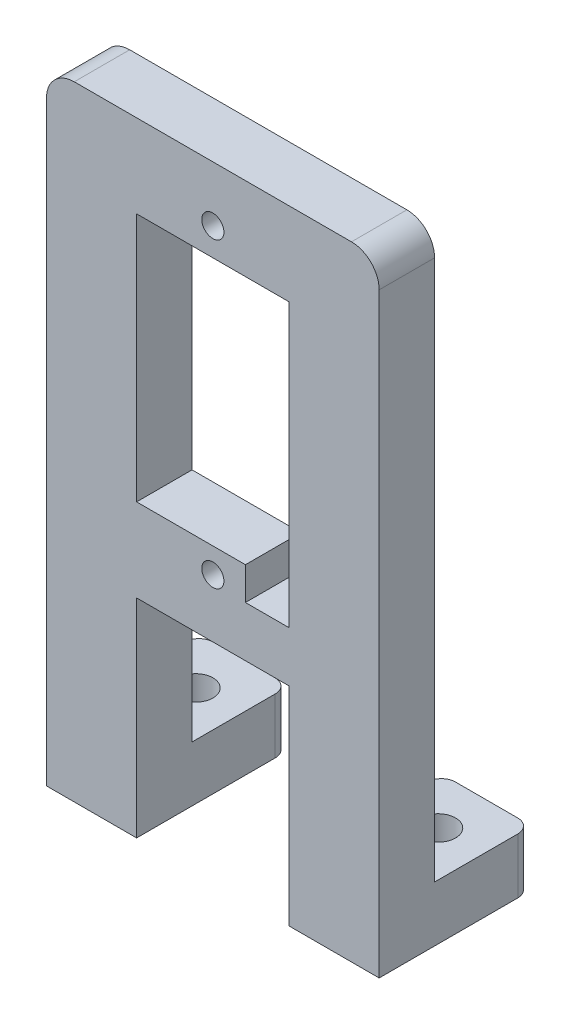
ISO-10303-21;
HEADER;
FILE_DESCRIPTION(('STEP AP214'),'2;1');
FILE_NAME('part.step','',(''),(''),'','','');
FILE_SCHEMA(('AUTOMOTIVE_DESIGN { 1 0 10303 214 1 1 1 1 }'));
ENDSEC;
DATA;
#1=APPLICATION_CONTEXT('core data for automotive mechanical design processes');
#2=APPLICATION_PROTOCOL_DEFINITION('international standard','automotive_design',2000,#1);
#3=PRODUCT_CONTEXT('',#1,'mechanical');
#4=PRODUCT('Part','Part','',(#3));
#5=PRODUCT_RELATED_PRODUCT_CATEGORY('part','',(#4));
#6=PRODUCT_DEFINITION_FORMATION('','',#4);
#7=PRODUCT_DEFINITION_CONTEXT('part definition',#1,'design');
#8=PRODUCT_DEFINITION('design','',#6,#7);
#9=PRODUCT_DEFINITION_SHAPE('','',#8);
#10=(LENGTH_UNIT() NAMED_UNIT(*) SI_UNIT(.MILLI.,.METRE.));
#11=(NAMED_UNIT(*) PLANE_ANGLE_UNIT() SI_UNIT($,.RADIAN.));
#12=(NAMED_UNIT(*) SI_UNIT($,.STERADIAN.) SOLID_ANGLE_UNIT());
#13=UNCERTAINTY_MEASURE_WITH_UNIT(LENGTH_MEASURE(1.E-05),#10,'distance_accuracy_value','');
#14=(GEOMETRIC_REPRESENTATION_CONTEXT(3) GLOBAL_UNCERTAINTY_ASSIGNED_CONTEXT((#13)) GLOBAL_UNIT_ASSIGNED_CONTEXT((#10,
#11,#12)) REPRESENTATION_CONTEXT('',''));
#15=CARTESIAN_POINT('',(0.,0.,0.));
#16=DIRECTION('',(0.,0.,1.));
#17=DIRECTION('',(1.,0.,0.));
#18=AXIS2_PLACEMENT_3D('',#15,#16,#17);
#19=CARTESIAN_POINT('',(0.,0.,0.));
#20=DIRECTION('',(0.,0.,-1.));
#21=DIRECTION('',(-1.,0.,0.));
#22=AXIS2_PLACEMENT_3D('',#19,#20,#21);
#23=PLANE('',#22);
#24=DIRECTION('',(-1.,0.,0.));
#25=VECTOR('',#24,1.);
#26=CARTESIAN_POINT('',(0.,-14.43,0.));
#27=LINE('',#26,#25);
#28=CARTESIAN_POINT('',(6.985,-14.43,0.));
#29=VERTEX_POINT('',#28);
#30=CARTESIAN_POINT('',(2.985,-14.43,0.));
#31=VERTEX_POINT('',#30);
#32=EDGE_CURVE('E233',#29,#31,#27,.T.);
#33=ORIENTED_EDGE('',*,*,#32,.F.);
#34=DIRECTION('',(0.,-1.,0.));
#35=VECTOR('',#34,1.);
#36=CARTESIAN_POINT('',(6.985,11.43,0.));
#37=LINE('',#36,#35);
#38=CARTESIAN_POINT('',(6.985,11.43,0.));
#39=VERTEX_POINT('',#38);
#40=EDGE_CURVE('E319',#39,#29,#37,.T.);
#41=ORIENTED_EDGE('',*,*,#40,.F.);
#42=DIRECTION('',(1.,0.,0.));
#43=VECTOR('',#42,1.);
#44=CARTESIAN_POINT('',(-6.985,11.43,0.));
#45=LINE('',#44,#43);
#46=CARTESIAN_POINT('',(-6.985,11.43,0.));
#47=VERTEX_POINT('',#46);
#48=EDGE_CURVE('E322',#47,#39,#45,.T.);
#49=ORIENTED_EDGE('',*,*,#48,.F.);
#50=DIRECTION('',(0.,-1.,0.));
#51=VECTOR('',#50,1.);
#52=CARTESIAN_POINT('',(-6.985,11.43,0.));
#53=LINE('',#52,#51);
#54=CARTESIAN_POINT('',(-6.985,-11.43,0.));
#55=VERTEX_POINT('',#54);
#56=EDGE_CURVE('E309',#47,#55,#53,.T.);
#57=ORIENTED_EDGE('',*,*,#56,.T.);
#58=DIRECTION('',(1.,0.,0.));
#59=VECTOR('',#58,1.);
#60=CARTESIAN_POINT('',(-6.985,-11.43,0.));
#61=LINE('',#60,#59);
#62=CARTESIAN_POINT('',(2.985,-11.43,0.));
#63=VERTEX_POINT('',#62);
#64=EDGE_CURVE('E316',#55,#63,#61,.T.);
#65=ORIENTED_EDGE('',*,*,#64,.T.);
#66=DIRECTION('',(0.,1.,0.));
#67=VECTOR('',#66,1.);
#68=CARTESIAN_POINT('',(2.985,0.,0.));
#69=LINE('',#68,#67);
#70=EDGE_CURVE('E251',#31,#63,#69,.T.);
#71=ORIENTED_EDGE('',*,*,#70,.F.);
#72=EDGE_LOOP('',(#33,#41,#49,#57,#65,#71));
#73=FACE_BOUND('',#72,.T.);
#74=CARTESIAN_POINT('',(0.,13.97,0.));
#75=DIRECTION('',(0.,0.,1.));
#76=DIRECTION('',(1.,0.,0.));
#77=AXIS2_PLACEMENT_3D('',#74,#75,#76);
#78=CIRCLE('',#77,1.016);
#79=CARTESIAN_POINT('',(1.016,13.97,0.));
#80=VERTEX_POINT('',#79);
#81=EDGE_CURVE('E281',#80,#80,#78,.T.);
#82=ORIENTED_EDGE('',*,*,#81,.T.);
#83=EDGE_LOOP('',(#82));
#84=FACE_BOUND('',#83,.T.);
#85=CARTESIAN_POINT('',(0.,-13.716,0.));
#86=DIRECTION('',(0.,0.,1.));
#87=DIRECTION('',(1.,0.,0.));
#88=AXIS2_PLACEMENT_3D('',#85,#86,#87);
#89=CIRCLE('',#88,1.016);
#90=CARTESIAN_POINT('',(1.016,-13.716,0.));
#91=VERTEX_POINT('',#90);
#92=EDGE_CURVE('E278',#91,#91,#89,.T.);
#93=ORIENTED_EDGE('',*,*,#92,.T.);
#94=EDGE_LOOP('',(#93));
#95=FACE_BOUND('',#94,.T.);
#96=DIRECTION('',(0.,-1.,0.));
#97=VECTOR('',#96,1.);
#98=CARTESIAN_POINT('',(15.24,19.05,0.));
#99=LINE('',#98,#97);
#100=CARTESIAN_POINT('',(15.24,16.51,0.));
#101=VERTEX_POINT('',#100);
#102=CARTESIAN_POINT('',(15.24,-33.02,0.));
#103=VERTEX_POINT('',#102);
#104=EDGE_CURVE('E348',#101,#103,#99,.T.);
#105=ORIENTED_EDGE('',*,*,#104,.T.);
#106=DIRECTION('',(-1.,0.,0.));
#107=VECTOR('',#106,1.);
#108=CARTESIAN_POINT('',(6.985,-33.02,0.));
#109=LINE('',#108,#107);
#110=CARTESIAN_POINT('',(6.985,-33.02,0.));
#111=VERTEX_POINT('',#110);
#112=EDGE_CURVE('E262',#103,#111,#109,.T.);
#113=ORIENTED_EDGE('',*,*,#112,.T.);
#114=DIRECTION('',(0.,1.,0.));
#115=VECTOR('',#114,1.);
#116=CARTESIAN_POINT('',(6.98499999999999,-38.1,0.));
#117=LINE('',#116,#115);
#118=CARTESIAN_POINT('',(6.98499999999999,-19.05,0.));
#119=VERTEX_POINT('',#118);
#120=EDGE_CURVE('E304',#111,#119,#117,.T.);
#121=ORIENTED_EDGE('',*,*,#120,.T.);
#122=DIRECTION('',(1.,0.,0.));
#123=VECTOR('',#122,1.);
#124=CARTESIAN_POINT('',(-15.24,-19.05,0.));
#125=LINE('',#124,#123);
#126=CARTESIAN_POINT('',(-6.985,-19.05,0.));
#127=VERTEX_POINT('',#126);
#128=EDGE_CURVE('E333',#127,#119,#125,.T.);
#129=ORIENTED_EDGE('',*,*,#128,.F.);
#130=DIRECTION('',(0.,1.,0.));
#131=VECTOR('',#130,1.);
#132=CARTESIAN_POINT('',(-6.98499999999999,-38.1,0.));
#133=LINE('',#132,#131);
#134=CARTESIAN_POINT('',(-6.985,-33.02,0.));
#135=VERTEX_POINT('',#134);
#136=EDGE_CURVE('E359',#135,#127,#133,.T.);
#137=ORIENTED_EDGE('',*,*,#136,.F.);
#138=DIRECTION('',(1.,0.,0.));
#139=VECTOR('',#138,1.);
#140=CARTESIAN_POINT('',(-6.985,-33.02,0.));
#141=LINE('',#140,#139);
#142=CARTESIAN_POINT('',(-15.24,-33.02,0.));
#143=VERTEX_POINT('',#142);
#144=EDGE_CURVE('E293',#143,#135,#141,.T.);
#145=ORIENTED_EDGE('',*,*,#144,.F.);
#146=DIRECTION('',(0.,-1.,0.));
#147=VECTOR('',#146,1.);
#148=CARTESIAN_POINT('',(-15.24,19.05,0.));
#149=LINE('',#148,#147);
#150=CARTESIAN_POINT('',(-15.24,16.51,0.));
#151=VERTEX_POINT('',#150);
#152=EDGE_CURVE('E338',#151,#143,#149,.T.);
#153=ORIENTED_EDGE('',*,*,#152,.F.);
#154=CARTESIAN_POINT('',(-12.7,16.51,0.));
#155=DIRECTION('',(0.,0.,-1.));
#156=DIRECTION('',(-1.,0.,0.));
#157=AXIS2_PLACEMENT_3D('',#154,#155,#156);
#158=CIRCLE('',#157,2.54);
#159=CARTESIAN_POINT('',(-12.7,19.05,0.));
#160=VERTEX_POINT('',#159);
#161=EDGE_CURVE('E391',#151,#160,#158,.T.);
#162=ORIENTED_EDGE('',*,*,#161,.T.);
#163=DIRECTION('',(1.,0.,0.));
#164=VECTOR('',#163,1.);
#165=CARTESIAN_POINT('',(-15.24,19.05,0.));
#166=LINE('',#165,#164);
#167=CARTESIAN_POINT('',(12.7,19.05,0.));
#168=VERTEX_POINT('',#167);
#169=EDGE_CURVE('E351',#160,#168,#166,.T.);
#170=ORIENTED_EDGE('',*,*,#169,.T.);
#171=CARTESIAN_POINT('',(12.7,16.51,0.));
#172=DIRECTION('',(0.,0.,-1.));
#173=DIRECTION('',(-1.,0.,0.));
#174=AXIS2_PLACEMENT_3D('',#171,#172,#173);
#175=CIRCLE('',#174,2.54);
#176=EDGE_CURVE('E393',#168,#101,#175,.T.);
#177=ORIENTED_EDGE('',*,*,#176,.T.);
#178=EDGE_LOOP('',(#105,#113,#121,#129,#137,#145,#153,#162,#170,#177));
#179=FACE_BOUND('',#178,.T.);
#180=ADVANCED_FACE('F63',(#73,#84,#95,#179),#23,.T.);
#181=CARTESIAN_POINT('',(6.985,11.43,5.08));
#182=DIRECTION('',(1.,0.,0.));
#183=DIRECTION('',(0.,0.,-1.));
#184=AXIS2_PLACEMENT_3D('',#181,#182,#183);
#185=PLANE('',#184);
#186=ORIENTED_EDGE('',*,*,#40,.T.);
#187=DIRECTION('',(0.,0.,1.));
#188=VECTOR('',#187,1.);
#189=CARTESIAN_POINT('',(6.985,-14.43,-8.89));
#190=LINE('',#189,#188);
#191=CARTESIAN_POINT('',(6.985,-14.43,5.08));
#192=VERTEX_POINT('',#191);
#193=EDGE_CURVE('E235',#29,#192,#190,.T.);
#194=ORIENTED_EDGE('',*,*,#193,.T.);
#195=DIRECTION('',(0.,-1.,0.));
#196=VECTOR('',#195,1.);
#197=CARTESIAN_POINT('',(6.985,11.43,5.08));
#198=LINE('',#197,#196);
#199=CARTESIAN_POINT('',(6.985,11.43,5.08));
#200=VERTEX_POINT('',#199);
#201=EDGE_CURVE('E246',#200,#192,#198,.T.);
#202=ORIENTED_EDGE('',*,*,#201,.F.);
#203=DIRECTION('',(0.,0.,-1.));
#204=VECTOR('',#203,1.);
#205=CARTESIAN_POINT('',(6.985,11.43,5.08));
#206=LINE('',#205,#204);
#207=EDGE_CURVE('E331',#200,#39,#206,.T.);
#208=ORIENTED_EDGE('',*,*,#207,.T.);
#209=EDGE_LOOP('',(#186,#194,#202,#208));
#210=FACE_BOUND('',#209,.T.);
#211=ADVANCED_FACE('F474',(#210),#185,.F.);
#212=CARTESIAN_POINT('',(-6.985,11.43,5.08));
#213=DIRECTION('',(0.,1.,0.));
#214=DIRECTION('',(0.,0.,1.));
#215=AXIS2_PLACEMENT_3D('',#212,#213,#214);
#216=PLANE('',#215);
#217=ORIENTED_EDGE('',*,*,#48,.T.);
#218=ORIENTED_EDGE('',*,*,#207,.F.);
#219=DIRECTION('',(1.,0.,0.));
#220=VECTOR('',#219,1.);
#221=CARTESIAN_POINT('',(-6.985,11.43,5.08));
#222=LINE('',#221,#220);
#223=CARTESIAN_POINT('',(-6.985,11.43,5.08));
#224=VERTEX_POINT('',#223);
#225=EDGE_CURVE('E311',#224,#200,#222,.T.);
#226=ORIENTED_EDGE('',*,*,#225,.F.);
#227=DIRECTION('',(0.,0.,-1.));
#228=VECTOR('',#227,1.);
#229=CARTESIAN_POINT('',(-6.985,11.43,5.08));
#230=LINE('',#229,#228);
#231=EDGE_CURVE('E329',#224,#47,#230,.T.);
#232=ORIENTED_EDGE('',*,*,#231,.T.);
#233=EDGE_LOOP('',(#217,#218,#226,#232));
#234=FACE_BOUND('',#233,.T.);
#235=ADVANCED_FACE('F481',(#234),#216,.F.);
#236=CARTESIAN_POINT('',(-6.985,11.43,5.08));
#237=DIRECTION('',(1.,0.,0.));
#238=DIRECTION('',(0.,0.,-1.));
#239=AXIS2_PLACEMENT_3D('',#236,#237,#238);
#240=PLANE('',#239);
#241=ORIENTED_EDGE('',*,*,#56,.F.);
#242=ORIENTED_EDGE('',*,*,#231,.F.);
#243=DIRECTION('',(0.,-1.,0.));
#244=VECTOR('',#243,1.);
#245=CARTESIAN_POINT('',(-6.985,11.43,5.08));
#246=LINE('',#245,#244);
#247=CARTESIAN_POINT('',(-6.985,-11.43,5.08));
#248=VERTEX_POINT('',#247);
#249=EDGE_CURVE('E313',#224,#248,#246,.T.);
#250=ORIENTED_EDGE('',*,*,#249,.T.);
#251=DIRECTION('',(0.,0.,-1.));
#252=VECTOR('',#251,1.);
#253=CARTESIAN_POINT('',(-6.985,-11.43,5.08));
#254=LINE('',#253,#252);
#255=EDGE_CURVE('E315',#248,#55,#254,.T.);
#256=ORIENTED_EDGE('',*,*,#255,.T.);
#257=EDGE_LOOP('',(#241,#242,#250,#256));
#258=FACE_BOUND('',#257,.T.);
#259=ADVANCED_FACE('F568',(#258),#240,.T.);
#260=CARTESIAN_POINT('',(-6.985,-11.43,5.08));
#261=DIRECTION('',(0.,1.,0.));
#262=DIRECTION('',(0.,0.,1.));
#263=AXIS2_PLACEMENT_3D('',#260,#261,#262);
#264=PLANE('',#263);
#265=DIRECTION('',(0.,0.,1.));
#266=VECTOR('',#265,1.);
#267=CARTESIAN_POINT('',(2.985,-11.43,-8.89));
#268=LINE('',#267,#266);
#269=CARTESIAN_POINT('',(2.985,-11.43,5.08));
#270=VERTEX_POINT('',#269);
#271=EDGE_CURVE('E78',#63,#270,#268,.T.);
#272=ORIENTED_EDGE('',*,*,#271,.F.);
#273=ORIENTED_EDGE('',*,*,#64,.F.);
#274=ORIENTED_EDGE('',*,*,#255,.F.);
#275=DIRECTION('',(1.,0.,0.));
#276=VECTOR('',#275,1.);
#277=CARTESIAN_POINT('',(-6.985,-11.43,5.08));
#278=LINE('',#277,#276);
#279=EDGE_CURVE('E307',#248,#270,#278,.T.);
#280=ORIENTED_EDGE('',*,*,#279,.T.);
#281=EDGE_LOOP('',(#272,#273,#274,#280));
#282=FACE_BOUND('',#281,.T.);
#283=ADVANCED_FACE('F571',(#282),#264,.T.);
#284=CARTESIAN_POINT('',(-15.24,19.05,5.08));
#285=DIRECTION('',(1.,0.,0.));
#286=DIRECTION('',(0.,0.,-1.));
#287=AXIS2_PLACEMENT_3D('',#284,#285,#286);
#288=PLANE('',#287);
#289=DIRECTION('',(0.,0.,1.));
#290=VECTOR('',#289,1.);
#291=CARTESIAN_POINT('',(-15.24,-33.02,0.));
#292=LINE('',#291,#290);
#293=CARTESIAN_POINT('',(-15.24,-33.02,-7.62));
#294=VERTEX_POINT('',#293);
#295=EDGE_CURVE('E302',#294,#143,#292,.T.);
#296=ORIENTED_EDGE('',*,*,#295,.F.);
#297=DIRECTION('',(0.,-1.,0.));
#298=VECTOR('',#297,1.);
#299=CARTESIAN_POINT('',(-15.24,19.05,-7.62));
#300=LINE('',#299,#298);
#301=CARTESIAN_POINT('',(-15.24,-38.1,-7.62));
#302=VERTEX_POINT('',#301);
#303=EDGE_CURVE('E12',#294,#302,#300,.T.);
#304=ORIENTED_EDGE('',*,*,#303,.T.);
#305=DIRECTION('',(0.,0.,-1.));
#306=VECTOR('',#305,1.);
#307=CARTESIAN_POINT('',(-15.24,-38.1,5.08));
#308=LINE('',#307,#306);
#309=CARTESIAN_POINT('',(-15.24,-38.1,5.08));
#310=VERTEX_POINT('',#309);
#311=EDGE_CURVE('E320',#310,#302,#308,.T.);
#312=ORIENTED_EDGE('',*,*,#311,.F.);
#313=DIRECTION('',(0.,-1.,0.));
#314=VECTOR('',#313,1.);
#315=CARTESIAN_POINT('',(-15.24,19.05,5.08));
#316=LINE('',#315,#314);
#317=CARTESIAN_POINT('',(-15.24,16.51,5.08));
#318=VERTEX_POINT('',#317);
#319=EDGE_CURVE('E343',#318,#310,#316,.T.);
#320=ORIENTED_EDGE('',*,*,#319,.F.);
#321=DIRECTION('',(0.,0.,-1.));
#322=VECTOR('',#321,1.);
#323=CARTESIAN_POINT('',(-15.24,16.51,0.));
#324=LINE('',#323,#322);
#325=EDGE_CURVE('E401',#318,#151,#324,.T.);
#326=ORIENTED_EDGE('',*,*,#325,.T.);
#327=ORIENTED_EDGE('',*,*,#152,.T.);
#328=EDGE_LOOP('',(#296,#304,#312,#320,#326,#327));
#329=FACE_BOUND('',#328,.T.);
#330=ADVANCED_FACE('F539',(#329),#288,.F.);
#331=CARTESIAN_POINT('',(-15.24,19.05,5.08));
#332=DIRECTION('',(0.,1.,0.));
#333=DIRECTION('',(0.,0.,1.));
#334=AXIS2_PLACEMENT_3D('',#331,#332,#333);
#335=PLANE('',#334);
#336=DIRECTION('',(1.,0.,0.));
#337=VECTOR('',#336,1.);
#338=CARTESIAN_POINT('',(-15.24,19.05,5.08));
#339=LINE('',#338,#337);
#340=CARTESIAN_POINT('',(-12.7,19.05,5.08));
#341=VERTEX_POINT('',#340);
#342=CARTESIAN_POINT('',(12.7,19.05,5.08));
#343=VERTEX_POINT('',#342);
#344=EDGE_CURVE('E340',#341,#343,#339,.T.);
#345=ORIENTED_EDGE('',*,*,#344,.T.);
#346=DIRECTION('',(0.,0.,-1.));
#347=VECTOR('',#346,1.);
#348=CARTESIAN_POINT('',(12.7,19.05,5.08));
#349=LINE('',#348,#347);
#350=EDGE_CURVE('E388',#343,#168,#349,.T.);
#351=ORIENTED_EDGE('',*,*,#350,.T.);
#352=ORIENTED_EDGE('',*,*,#169,.F.);
#353=DIRECTION('',(0.,0.,-1.));
#354=VECTOR('',#353,1.);
#355=CARTESIAN_POINT('',(-12.7,19.05,5.08));
#356=LINE('',#355,#354);
#357=EDGE_CURVE('E368',#160,#341,#356,.F.);
#358=ORIENTED_EDGE('',*,*,#357,.T.);
#359=EDGE_LOOP('',(#345,#351,#352,#358));
#360=FACE_BOUND('',#359,.T.);
#361=ADVANCED_FACE('F531',(#360),#335,.T.);
#362=CARTESIAN_POINT('',(15.24,19.05,5.08));
#363=DIRECTION('',(1.,0.,0.));
#364=DIRECTION('',(0.,0.,-1.));
#365=AXIS2_PLACEMENT_3D('',#362,#363,#364);
#366=PLANE('',#365);
#367=DIRECTION('',(0.,0.,-1.));
#368=VECTOR('',#367,1.);
#369=CARTESIAN_POINT('',(15.24,-38.1,5.08));
#370=LINE('',#369,#368);
#371=CARTESIAN_POINT('',(15.24,-38.1,5.08));
#372=VERTEX_POINT('',#371);
#373=CARTESIAN_POINT('',(15.24,-38.1,-7.62));
#374=VERTEX_POINT('',#373);
#375=EDGE_CURVE('E379',#372,#374,#370,.T.);
#376=ORIENTED_EDGE('',*,*,#375,.T.);
#377=DIRECTION('',(0.,-1.,0.));
#378=VECTOR('',#377,1.);
#379=CARTESIAN_POINT('',(15.24,19.05,-7.62));
#380=LINE('',#379,#378);
#381=CARTESIAN_POINT('',(15.24,-33.02,-7.62));
#382=VERTEX_POINT('',#381);
#383=EDGE_CURVE('E428',#374,#382,#380,.F.);
#384=ORIENTED_EDGE('',*,*,#383,.T.);
#385=DIRECTION('',(0.,0.,1.));
#386=VECTOR('',#385,1.);
#387=CARTESIAN_POINT('',(15.24,-33.02,0.));
#388=LINE('',#387,#386);
#389=EDGE_CURVE('E265',#382,#103,#388,.T.);
#390=ORIENTED_EDGE('',*,*,#389,.T.);
#391=ORIENTED_EDGE('',*,*,#104,.F.);
#392=DIRECTION('',(0.,0.,-1.));
#393=VECTOR('',#392,1.);
#394=CARTESIAN_POINT('',(15.24,16.51,5.08));
#395=LINE('',#394,#393);
#396=CARTESIAN_POINT('',(15.24,16.51,5.08));
#397=VERTEX_POINT('',#396);
#398=EDGE_CURVE('E395',#101,#397,#395,.F.);
#399=ORIENTED_EDGE('',*,*,#398,.T.);
#400=DIRECTION('',(0.,-1.,0.));
#401=VECTOR('',#400,1.);
#402=CARTESIAN_POINT('',(15.24,19.05,5.08));
#403=LINE('',#402,#401);
#404=EDGE_CURVE('E337',#397,#372,#403,.T.);
#405=ORIENTED_EDGE('',*,*,#404,.T.);
#406=EDGE_LOOP('',(#376,#384,#390,#391,#399,#405));
#407=FACE_BOUND('',#406,.T.);
#408=ADVANCED_FACE('F524',(#407),#366,.T.);
#409=CARTESIAN_POINT('',(0.,0.,5.08));
#410=DIRECTION('',(0.,0.,-1.));
#411=DIRECTION('',(-1.,0.,0.));
#412=AXIS2_PLACEMENT_3D('',#409,#410,#411);
#413=PLANE('',#412);
#414=CARTESIAN_POINT('',(0.,13.97,5.08));
#415=DIRECTION('',(0.,0.,1.));
#416=DIRECTION('',(1.,0.,0.));
#417=AXIS2_PLACEMENT_3D('',#414,#415,#416);
#418=CIRCLE('',#417,1.016);
#419=CARTESIAN_POINT('',(1.016,13.97,5.08));
#420=VERTEX_POINT('',#419);
#421=EDGE_CURVE('E285',#420,#420,#418,.T.);
#422=ORIENTED_EDGE('',*,*,#421,.F.);
#423=EDGE_LOOP('',(#422));
#424=FACE_BOUND('',#423,.T.);
#425=CARTESIAN_POINT('',(0.,-13.716,5.08));
#426=DIRECTION('',(0.,0.,1.));
#427=DIRECTION('',(1.,0.,0.));
#428=AXIS2_PLACEMENT_3D('',#425,#426,#427);
#429=CIRCLE('',#428,1.016);
#430=CARTESIAN_POINT('',(1.016,-13.716,5.08));
#431=VERTEX_POINT('',#430);
#432=EDGE_CURVE('E288',#431,#431,#429,.T.);
#433=ORIENTED_EDGE('',*,*,#432,.F.);
#434=EDGE_LOOP('',(#433));
#435=FACE_BOUND('',#434,.T.);
#436=ORIENTED_EDGE('',*,*,#404,.F.);
#437=CARTESIAN_POINT('',(12.7,16.51,5.08));
#438=DIRECTION('',(0.,0.,-1.));
#439=DIRECTION('',(-1.,0.,0.));
#440=AXIS2_PLACEMENT_3D('',#437,#438,#439);
#441=CIRCLE('',#440,2.54);
#442=EDGE_CURVE('E399',#397,#343,#441,.F.);
#443=ORIENTED_EDGE('',*,*,#442,.T.);
#444=ORIENTED_EDGE('',*,*,#344,.F.);
#445=CARTESIAN_POINT('',(-12.7,16.51,5.08));
#446=DIRECTION('',(0.,0.,-1.));
#447=DIRECTION('',(-1.,0.,0.));
#448=AXIS2_PLACEMENT_3D('',#445,#446,#447);
#449=CIRCLE('',#448,2.54);
#450=EDGE_CURVE('E397',#341,#318,#449,.F.);
#451=ORIENTED_EDGE('',*,*,#450,.T.);
#452=ORIENTED_EDGE('',*,*,#319,.T.);
#453=DIRECTION('',(1.,0.,0.));
#454=VECTOR('',#453,1.);
#455=CARTESIAN_POINT('',(-15.24,-38.1,5.08));
#456=LINE('',#455,#454);
#457=CARTESIAN_POINT('',(-6.98499999999999,-38.1,5.08));
#458=VERTEX_POINT('',#457);
#459=EDGE_CURVE('E356',#310,#458,#456,.T.);
#460=ORIENTED_EDGE('',*,*,#459,.T.);
#461=DIRECTION('',(0.,1.,0.));
#462=VECTOR('',#461,1.);
#463=CARTESIAN_POINT('',(-6.98499999999999,-38.1,5.08));
#464=LINE('',#463,#462);
#465=CARTESIAN_POINT('',(-6.985,-19.05,5.08));
#466=VERTEX_POINT('',#465);
#467=EDGE_CURVE('E358',#458,#466,#464,.T.);
#468=ORIENTED_EDGE('',*,*,#467,.T.);
#469=DIRECTION('',(1.,0.,0.));
#470=VECTOR('',#469,1.);
#471=CARTESIAN_POINT('',(-15.24,-19.05,5.08));
#472=LINE('',#471,#470);
#473=CARTESIAN_POINT('',(6.98499999999999,-19.05,5.08));
#474=VERTEX_POINT('',#473);
#475=EDGE_CURVE('E334',#466,#474,#472,.T.);
#476=ORIENTED_EDGE('',*,*,#475,.T.);
#477=DIRECTION('',(0.,1.,0.));
#478=VECTOR('',#477,1.);
#479=CARTESIAN_POINT('',(6.98499999999999,-38.1,5.08));
#480=LINE('',#479,#478);
#481=CARTESIAN_POINT('',(6.98499999999999,-38.1,5.08));
#482=VERTEX_POINT('',#481);
#483=EDGE_CURVE('E376',#482,#474,#480,.T.);
#484=ORIENTED_EDGE('',*,*,#483,.F.);
#485=DIRECTION('',(-1.,0.,0.));
#486=VECTOR('',#485,1.);
#487=CARTESIAN_POINT('',(15.24,-38.1,5.08));
#488=LINE('',#487,#486);
#489=EDGE_CURVE('E373',#372,#482,#488,.T.);
#490=ORIENTED_EDGE('',*,*,#489,.F.);
#491=EDGE_LOOP('',(#436,#443,#444,#451,#452,#460,#468,#476,#484,#490));
#492=FACE_BOUND('',#491,.T.);
#493=ORIENTED_EDGE('',*,*,#201,.T.);
#494=DIRECTION('',(1.,0.,0.));
#495=VECTOR('',#494,1.);
#496=CARTESIAN_POINT('',(6.985,-14.43,5.08));
#497=LINE('',#496,#495);
#498=CARTESIAN_POINT('',(2.985,-14.43,5.08));
#499=VERTEX_POINT('',#498);
#500=EDGE_CURVE('E231',#499,#192,#497,.T.);
#501=ORIENTED_EDGE('',*,*,#500,.F.);
#502=DIRECTION('',(0.,-1.,0.));
#503=VECTOR('',#502,1.);
#504=CARTESIAN_POINT('',(2.985,-14.43,5.08));
#505=LINE('',#504,#503);
#506=EDGE_CURVE('E237',#270,#499,#505,.T.);
#507=ORIENTED_EDGE('',*,*,#506,.F.);
#508=ORIENTED_EDGE('',*,*,#279,.F.);
#509=ORIENTED_EDGE('',*,*,#249,.F.);
#510=ORIENTED_EDGE('',*,*,#225,.T.);
#511=EDGE_LOOP('',(#493,#501,#507,#508,#509,#510));
#512=FACE_BOUND('',#511,.T.);
#513=ADVANCED_FACE('F243',(#424,#435,#492,#512),#413,.F.);
#514=CARTESIAN_POINT('',(-15.24,-19.05,5.08));
#515=DIRECTION('',(0.,1.,0.));
#516=DIRECTION('',(0.,0.,1.));
#517=AXIS2_PLACEMENT_3D('',#514,#515,#516);
#518=PLANE('',#517);
#519=ORIENTED_EDGE('',*,*,#475,.F.);
#520=DIRECTION('',(0.,0.,-1.));
#521=VECTOR('',#520,1.);
#522=CARTESIAN_POINT('',(-6.98499999999999,-19.05,5.08));
#523=LINE('',#522,#521);
#524=EDGE_CURVE('E365',#466,#127,#523,.T.);
#525=ORIENTED_EDGE('',*,*,#524,.T.);
#526=ORIENTED_EDGE('',*,*,#128,.T.);
#527=DIRECTION('',(0.,0.,-1.));
#528=VECTOR('',#527,1.);
#529=CARTESIAN_POINT('',(6.98499999999999,-19.05,5.08));
#530=LINE('',#529,#528);
#531=EDGE_CURVE('E345',#474,#119,#530,.T.);
#532=ORIENTED_EDGE('',*,*,#531,.F.);
#533=EDGE_LOOP('',(#519,#525,#526,#532));
#534=FACE_BOUND('',#533,.T.);
#535=ADVANCED_FACE('F448',(#534),#518,.F.);
#536=CARTESIAN_POINT('',(15.24,-38.1,5.08));
#537=DIRECTION('',(0.,-1.,0.));
#538=DIRECTION('',(0.,0.,-1.));
#539=AXIS2_PLACEMENT_3D('',#536,#537,#538);
#540=PLANE('',#539);
#541=CARTESIAN_POINT('',(11.1125,-38.1,-4.445));
#542=DIRECTION('',(0.,-1.,0.));
#543=DIRECTION('',(0.,0.,1.));
#544=AXIS2_PLACEMENT_3D('',#541,#542,#543);
#545=CIRCLE('',#544,1.6);
#546=CARTESIAN_POINT('',(11.1125,-38.1,-2.845));
#547=VERTEX_POINT('',#546);
#548=EDGE_CURVE('E256',#547,#547,#545,.T.);
#549=ORIENTED_EDGE('',*,*,#548,.F.);
#550=EDGE_LOOP('',(#549));
#551=FACE_BOUND('',#550,.T.);
#552=DIRECTION('',(1.,0.,0.));
#553=VECTOR('',#552,1.);
#554=CARTESIAN_POINT('',(15.24,-38.1,-8.89));
#555=LINE('',#554,#553);
#556=CARTESIAN_POINT('',(8.25499999999999,-38.1,-8.89));
#557=VERTEX_POINT('',#556);
#558=CARTESIAN_POINT('',(13.97,-38.1,-8.89));
#559=VERTEX_POINT('',#558);
#560=EDGE_CURVE('E259',#557,#559,#555,.T.);
#561=ORIENTED_EDGE('',*,*,#560,.T.);
#562=CARTESIAN_POINT('',(13.97,-38.1,-7.62));
#563=DIRECTION('',(0.,-1.,0.));
#564=DIRECTION('',(0.,0.,-1.));
#565=AXIS2_PLACEMENT_3D('',#562,#563,#564);
#566=CIRCLE('',#565,1.27);
#567=EDGE_CURVE('E426',#559,#374,#566,.T.);
#568=ORIENTED_EDGE('',*,*,#567,.T.);
#569=ORIENTED_EDGE('',*,*,#375,.F.);
#570=ORIENTED_EDGE('',*,*,#489,.T.);
#571=DIRECTION('',(0.,0.,-1.));
#572=VECTOR('',#571,1.);
#573=CARTESIAN_POINT('',(6.98499999999999,-38.1,5.08));
#574=LINE('',#573,#572);
#575=CARTESIAN_POINT('',(6.98499999999999,-38.1,-7.62));
#576=VERTEX_POINT('',#575);
#577=EDGE_CURVE('E364',#482,#576,#574,.T.);
#578=ORIENTED_EDGE('',*,*,#577,.T.);
#579=CARTESIAN_POINT('',(8.25499999999999,-38.1,-7.62));
#580=DIRECTION('',(0.,-1.,0.));
#581=DIRECTION('',(0.,0.,-1.));
#582=AXIS2_PLACEMENT_3D('',#579,#580,#581);
#583=CIRCLE('',#582,1.27);
#584=EDGE_CURVE('E424',#576,#557,#583,.T.);
#585=ORIENTED_EDGE('',*,*,#584,.T.);
#586=EDGE_LOOP('',(#561,#568,#569,#570,#578,#585));
#587=FACE_BOUND('',#586,.T.);
#588=ADVANCED_FACE('F438',(#551,#587),#540,.T.);
#589=CARTESIAN_POINT('',(6.98499999999999,-38.1,5.08));
#590=DIRECTION('',(-1.,0.,0.));
#591=DIRECTION('',(0.,0.,1.));
#592=AXIS2_PLACEMENT_3D('',#589,#590,#591);
#593=PLANE('',#592);
#594=DIRECTION('',(0.,0.,-1.));
#595=VECTOR('',#594,1.);
#596=CARTESIAN_POINT('',(6.985,-33.02,-8.89));
#597=LINE('',#596,#595);
#598=CARTESIAN_POINT('',(6.985,-33.02,-7.62));
#599=VERTEX_POINT('',#598);
#600=EDGE_CURVE('E270',#111,#599,#597,.T.);
#601=ORIENTED_EDGE('',*,*,#600,.T.);
#602=DIRECTION('',(0.,-1.,0.));
#603=VECTOR('',#602,1.);
#604=CARTESIAN_POINT('',(6.98499999999999,-38.1,-7.62));
#605=LINE('',#604,#603);
#606=EDGE_CURVE('E71',#599,#576,#605,.T.);
#607=ORIENTED_EDGE('',*,*,#606,.T.);
#608=ORIENTED_EDGE('',*,*,#577,.F.);
#609=ORIENTED_EDGE('',*,*,#483,.T.);
#610=ORIENTED_EDGE('',*,*,#531,.T.);
#611=ORIENTED_EDGE('',*,*,#120,.F.);
#612=EDGE_LOOP('',(#601,#607,#608,#609,#610,#611));
#613=FACE_BOUND('',#612,.T.);
#614=ADVANCED_FACE('F435',(#613),#593,.T.);
#615=CARTESIAN_POINT('',(-15.24,-38.1,5.08));
#616=DIRECTION('',(0.,1.,0.));
#617=DIRECTION('',(0.,0.,1.));
#618=AXIS2_PLACEMENT_3D('',#615,#616,#617);
#619=PLANE('',#618);
#620=CARTESIAN_POINT('',(-11.1125,-38.1,-4.445));
#621=DIRECTION('',(0.,1.,0.));
#622=DIRECTION('',(0.,0.,1.));
#623=AXIS2_PLACEMENT_3D('',#620,#621,#622);
#624=CIRCLE('',#623,1.6);
#625=CARTESIAN_POINT('',(-11.1125,-38.1,-2.845));
#626=VERTEX_POINT('',#625);
#627=EDGE_CURVE('E275',#626,#626,#624,.T.);
#628=ORIENTED_EDGE('',*,*,#627,.T.);
#629=EDGE_LOOP('',(#628));
#630=FACE_BOUND('',#629,.T.);
#631=DIRECTION('',(-1.,0.,0.));
#632=VECTOR('',#631,1.);
#633=CARTESIAN_POINT('',(-15.24,-38.1,-8.89));
#634=LINE('',#633,#632);
#635=CARTESIAN_POINT('',(-8.25499999999999,-38.1,-8.89));
#636=VERTEX_POINT('',#635);
#637=CARTESIAN_POINT('',(-13.97,-38.1,-8.89));
#638=VERTEX_POINT('',#637);
#639=EDGE_CURVE('E284',#636,#638,#634,.T.);
#640=ORIENTED_EDGE('',*,*,#639,.F.);
#641=CARTESIAN_POINT('',(-8.25499999999999,-38.1,-7.62));
#642=DIRECTION('',(0.,1.,0.));
#643=DIRECTION('',(0.,0.,1.));
#644=AXIS2_PLACEMENT_3D('',#641,#642,#643);
#645=CIRCLE('',#644,1.27);
#646=CARTESIAN_POINT('',(-6.98499999999999,-38.1,-7.62));
#647=VERTEX_POINT('',#646);
#648=EDGE_CURVE('E411',#636,#647,#645,.F.);
#649=ORIENTED_EDGE('',*,*,#648,.T.);
#650=DIRECTION('',(0.,0.,-1.));
#651=VECTOR('',#650,1.);
#652=CARTESIAN_POINT('',(-6.98499999999999,-38.1,5.08));
#653=LINE('',#652,#651);
#654=EDGE_CURVE('E362',#458,#647,#653,.T.);
#655=ORIENTED_EDGE('',*,*,#654,.F.);
#656=ORIENTED_EDGE('',*,*,#459,.F.);
#657=ORIENTED_EDGE('',*,*,#311,.T.);
#658=CARTESIAN_POINT('',(-13.97,-38.1,-7.62));
#659=DIRECTION('',(0.,1.,0.));
#660=DIRECTION('',(0.,0.,1.));
#661=AXIS2_PLACEMENT_3D('',#658,#659,#660);
#662=CIRCLE('',#661,1.27);
#663=EDGE_CURVE('E409',#302,#638,#662,.F.);
#664=ORIENTED_EDGE('',*,*,#663,.T.);
#665=EDGE_LOOP('',(#640,#649,#655,#656,#657,#664));
#666=FACE_BOUND('',#665,.T.);
#667=ADVANCED_FACE('F488',(#630,#666),#619,.F.);
#668=CARTESIAN_POINT('',(-6.98499999999999,-38.1,5.08));
#669=DIRECTION('',(-1.,0.,0.));
#670=DIRECTION('',(0.,0.,1.));
#671=AXIS2_PLACEMENT_3D('',#668,#669,#670);
#672=PLANE('',#671);
#673=ORIENTED_EDGE('',*,*,#654,.T.);
#674=DIRECTION('',(0.,-1.,0.));
#675=VECTOR('',#674,1.);
#676=CARTESIAN_POINT('',(-6.98499999999999,-38.1,-7.62));
#677=LINE('',#676,#675);
#678=CARTESIAN_POINT('',(-6.985,-33.02,-7.62));
#679=VERTEX_POINT('',#678);
#680=EDGE_CURVE('E413',#647,#679,#677,.F.);
#681=ORIENTED_EDGE('',*,*,#680,.T.);
#682=DIRECTION('',(0.,0.,-1.));
#683=VECTOR('',#682,1.);
#684=CARTESIAN_POINT('',(-6.985,-33.02,-8.89));
#685=LINE('',#684,#683);
#686=EDGE_CURVE('E296',#135,#679,#685,.T.);
#687=ORIENTED_EDGE('',*,*,#686,.F.);
#688=ORIENTED_EDGE('',*,*,#136,.T.);
#689=ORIENTED_EDGE('',*,*,#524,.F.);
#690=ORIENTED_EDGE('',*,*,#467,.F.);
#691=EDGE_LOOP('',(#673,#681,#687,#688,#689,#690));
#692=FACE_BOUND('',#691,.T.);
#693=ADVANCED_FACE('F494',(#692),#672,.F.);
#694=CARTESIAN_POINT('',(12.7,16.51,5.08));
#695=DIRECTION('',(0.,0.,-1.));
#696=DIRECTION('',(-1.,0.,0.));
#697=AXIS2_PLACEMENT_3D('',#694,#695,#696);
#698=CYLINDRICAL_SURFACE('',#697,2.54);
#699=ORIENTED_EDGE('',*,*,#442,.F.);
#700=ORIENTED_EDGE('',*,*,#398,.F.);
#701=ORIENTED_EDGE('',*,*,#176,.F.);
#702=ORIENTED_EDGE('',*,*,#350,.F.);
#703=EDGE_LOOP('',(#699,#700,#701,#702));
#704=FACE_BOUND('',#703,.T.);
#705=ADVANCED_FACE('F501',(#704),#698,.T.);
#706=CARTESIAN_POINT('',(-12.7,16.51,5.08));
#707=DIRECTION('',(0.,0.,1.));
#708=DIRECTION('',(1.,0.,0.));
#709=AXIS2_PLACEMENT_3D('',#706,#707,#708);
#710=CYLINDRICAL_SURFACE('',#709,2.54);
#711=ORIENTED_EDGE('',*,*,#450,.F.);
#712=ORIENTED_EDGE('',*,*,#357,.F.);
#713=ORIENTED_EDGE('',*,*,#161,.F.);
#714=ORIENTED_EDGE('',*,*,#325,.F.);
#715=EDGE_LOOP('',(#711,#712,#713,#714));
#716=FACE_BOUND('',#715,.T.);
#717=ADVANCED_FACE('F504',(#716),#710,.T.);
#718=CARTESIAN_POINT('',(-15.24,-33.02,-8.89));
#719=DIRECTION('',(0.,0.,1.));
#720=DIRECTION('',(1.,0.,0.));
#721=AXIS2_PLACEMENT_3D('',#718,#719,#720);
#722=PLANE('',#721);
#723=DIRECTION('',(-1.,0.,0.));
#724=VECTOR('',#723,1.);
#725=CARTESIAN_POINT('',(-15.24,-33.02,-8.89));
#726=LINE('',#725,#724);
#727=CARTESIAN_POINT('',(-8.25499999999999,-33.02,-8.89));
#728=VERTEX_POINT('',#727);
#729=CARTESIAN_POINT('',(-13.97,-33.02,-8.89));
#730=VERTEX_POINT('',#729);
#731=EDGE_CURVE('E299',#728,#730,#726,.T.);
#732=ORIENTED_EDGE('',*,*,#731,.F.);
#733=DIRECTION('',(0.,-1.,0.));
#734=VECTOR('',#733,1.);
#735=CARTESIAN_POINT('',(-8.25499999999999,-33.02,-8.89));
#736=LINE('',#735,#734);
#737=EDGE_CURVE('E406',#728,#636,#736,.T.);
#738=ORIENTED_EDGE('',*,*,#737,.T.);
#739=ORIENTED_EDGE('',*,*,#639,.T.);
#740=DIRECTION('',(0.,-1.,0.));
#741=VECTOR('',#740,1.);
#742=CARTESIAN_POINT('',(-13.97,-33.02,-8.89));
#743=LINE('',#742,#741);
#744=EDGE_CURVE('E404',#638,#730,#743,.F.);
#745=ORIENTED_EDGE('',*,*,#744,.T.);
#746=EDGE_LOOP('',(#732,#738,#739,#745));
#747=FACE_BOUND('',#746,.T.);
#748=ADVANCED_FACE('F508',(#747),#722,.F.);
#749=CARTESIAN_POINT('',(0.,-33.02,0.));
#750=DIRECTION('',(0.,-1.,0.));
#751=DIRECTION('',(0.,0.,-1.));
#752=AXIS2_PLACEMENT_3D('',#749,#750,#751);
#753=PLANE('',#752);
#754=CARTESIAN_POINT('',(-11.1125,-33.02,-4.445));
#755=DIRECTION('',(0.,1.,0.));
#756=DIRECTION('',(0.,0.,1.));
#757=AXIS2_PLACEMENT_3D('',#754,#755,#756);
#758=CIRCLE('',#757,1.6);
#759=CARTESIAN_POINT('',(-11.1125,-33.02,-2.845));
#760=VERTEX_POINT('',#759);
#761=EDGE_CURVE('E272',#760,#760,#758,.T.);
#762=ORIENTED_EDGE('',*,*,#761,.F.);
#763=EDGE_LOOP('',(#762));
#764=FACE_BOUND('',#763,.T.);
#765=ORIENTED_EDGE('',*,*,#686,.T.);
#766=CARTESIAN_POINT('',(-8.25499999999999,-33.02,-7.62));
#767=DIRECTION('',(0.,-1.,0.));
#768=DIRECTION('',(0.,0.,-1.));
#769=AXIS2_PLACEMENT_3D('',#766,#767,#768);
#770=CIRCLE('',#769,1.27);
#771=EDGE_CURVE('E417',#679,#728,#770,.F.);
#772=ORIENTED_EDGE('',*,*,#771,.T.);
#773=ORIENTED_EDGE('',*,*,#731,.T.);
#774=CARTESIAN_POINT('',(-13.97,-33.02,-7.62));
#775=DIRECTION('',(0.,-1.,0.));
#776=DIRECTION('',(0.,0.,-1.));
#777=AXIS2_PLACEMENT_3D('',#774,#775,#776);
#778=CIRCLE('',#777,1.27);
#779=EDGE_CURVE('E415',#730,#294,#778,.F.);
#780=ORIENTED_EDGE('',*,*,#779,.T.);
#781=ORIENTED_EDGE('',*,*,#295,.T.);
#782=ORIENTED_EDGE('',*,*,#144,.T.);
#783=EDGE_LOOP('',(#765,#772,#773,#780,#781,#782));
#784=FACE_BOUND('',#783,.T.);
#785=ADVANCED_FACE('F550',(#764,#784),#753,.F.);
#786=CARTESIAN_POINT('',(0.,-13.716,0.));
#787=DIRECTION('',(0.,0.,1.));
#788=DIRECTION('',(1.,0.,0.));
#789=AXIS2_PLACEMENT_3D('',#786,#787,#788);
#790=CYLINDRICAL_SURFACE('',#789,1.016);
#791=ORIENTED_EDGE('',*,*,#92,.F.);
#792=EDGE_LOOP('',(#791));
#793=FACE_BOUND('',#792,.T.);
#794=ORIENTED_EDGE('',*,*,#432,.T.);
#795=EDGE_LOOP('',(#794));
#796=FACE_BOUND('',#795,.T.);
#797=ADVANCED_FACE('F563',(#793,#796),#790,.F.);
#798=CARTESIAN_POINT('',(0.,13.97,0.));
#799=DIRECTION('',(0.,0.,1.));
#800=DIRECTION('',(1.,0.,0.));
#801=AXIS2_PLACEMENT_3D('',#798,#799,#800);
#802=CYLINDRICAL_SURFACE('',#801,1.016);
#803=ORIENTED_EDGE('',*,*,#81,.F.);
#804=EDGE_LOOP('',(#803));
#805=FACE_BOUND('',#804,.T.);
#806=ORIENTED_EDGE('',*,*,#421,.T.);
#807=EDGE_LOOP('',(#806));
#808=FACE_BOUND('',#807,.T.);
#809=ADVANCED_FACE('F592',(#805,#808),#802,.F.);
#810=CARTESIAN_POINT('',(-11.1125,-38.1,-4.445));
#811=DIRECTION('',(0.,1.,0.));
#812=DIRECTION('',(0.,0.,1.));
#813=AXIS2_PLACEMENT_3D('',#810,#811,#812);
#814=CYLINDRICAL_SURFACE('',#813,1.6);
#815=ORIENTED_EDGE('',*,*,#627,.F.);
#816=EDGE_LOOP('',(#815));
#817=FACE_BOUND('',#816,.T.);
#818=ORIENTED_EDGE('',*,*,#761,.T.);
#819=EDGE_LOOP('',(#818));
#820=FACE_BOUND('',#819,.T.);
#821=ADVANCED_FACE('F470',(#817,#820),#814,.F.);
#822=CARTESIAN_POINT('',(15.24,-33.02,-8.89));
#823=DIRECTION('',(0.,0.,-1.));
#824=DIRECTION('',(-1.,0.,0.));
#825=AXIS2_PLACEMENT_3D('',#822,#823,#824);
#826=PLANE('',#825);
#827=DIRECTION('',(1.,0.,0.));
#828=VECTOR('',#827,1.);
#829=CARTESIAN_POINT('',(15.24,-33.02,-8.89));
#830=LINE('',#829,#828);
#831=CARTESIAN_POINT('',(8.25499999999999,-33.02,-8.89));
#832=VERTEX_POINT('',#831);
#833=CARTESIAN_POINT('',(13.97,-33.02,-8.89));
#834=VERTEX_POINT('',#833);
#835=EDGE_CURVE('E267',#832,#834,#830,.T.);
#836=ORIENTED_EDGE('',*,*,#835,.T.);
#837=DIRECTION('',(0.,-1.,0.));
#838=VECTOR('',#837,1.);
#839=CARTESIAN_POINT('',(13.97,-33.02,-8.89));
#840=LINE('',#839,#838);
#841=EDGE_CURVE('E421',#834,#559,#840,.T.);
#842=ORIENTED_EDGE('',*,*,#841,.T.);
#843=ORIENTED_EDGE('',*,*,#560,.F.);
#844=DIRECTION('',(0.,-1.,0.));
#845=VECTOR('',#844,1.);
#846=CARTESIAN_POINT('',(8.25499999999999,-33.02,-8.89));
#847=LINE('',#846,#845);
#848=EDGE_CURVE('E419',#557,#832,#847,.F.);
#849=ORIENTED_EDGE('',*,*,#848,.T.);
#850=EDGE_LOOP('',(#836,#842,#843,#849));
#851=FACE_BOUND('',#850,.T.);
#852=ADVANCED_FACE('F459',(#851),#826,.T.);
#853=CARTESIAN_POINT('',(0.,-33.02,0.));
#854=DIRECTION('',(0.,-1.,0.));
#855=DIRECTION('',(0.,0.,-1.));
#856=AXIS2_PLACEMENT_3D('',#853,#854,#855);
#857=PLANE('',#856);
#858=CARTESIAN_POINT('',(11.1125,-33.02,-4.445));
#859=DIRECTION('',(0.,-1.,0.));
#860=DIRECTION('',(0.,0.,1.));
#861=AXIS2_PLACEMENT_3D('',#858,#859,#860);
#862=CIRCLE('',#861,1.6);
#863=CARTESIAN_POINT('',(11.1125,-33.02,-2.845));
#864=VERTEX_POINT('',#863);
#865=EDGE_CURVE('E255',#864,#864,#862,.T.);
#866=ORIENTED_EDGE('',*,*,#865,.T.);
#867=EDGE_LOOP('',(#866));
#868=FACE_BOUND('',#867,.T.);
#869=ORIENTED_EDGE('',*,*,#389,.F.);
#870=CARTESIAN_POINT('',(13.97,-33.02,-7.62));
#871=DIRECTION('',(0.,-1.,0.));
#872=DIRECTION('',(0.,0.,-1.));
#873=AXIS2_PLACEMENT_3D('',#870,#871,#872);
#874=CIRCLE('',#873,1.27);
#875=EDGE_CURVE('E431',#382,#834,#874,.F.);
#876=ORIENTED_EDGE('',*,*,#875,.T.);
#877=ORIENTED_EDGE('',*,*,#835,.F.);
#878=CARTESIAN_POINT('',(8.25499999999999,-33.02,-7.62));
#879=DIRECTION('',(0.,-1.,0.));
#880=DIRECTION('',(0.,0.,-1.));
#881=AXIS2_PLACEMENT_3D('',#878,#879,#880);
#882=CIRCLE('',#881,1.27);
#883=EDGE_CURVE('E86',#832,#599,#882,.F.);
#884=ORIENTED_EDGE('',*,*,#883,.T.);
#885=ORIENTED_EDGE('',*,*,#600,.F.);
#886=ORIENTED_EDGE('',*,*,#112,.F.);
#887=EDGE_LOOP('',(#869,#876,#877,#884,#885,#886));
#888=FACE_BOUND('',#887,.T.);
#889=ADVANCED_FACE('F455',(#868,#888),#857,.F.);
#890=CARTESIAN_POINT('',(11.1125,-38.1,-4.445));
#891=DIRECTION('',(0.,1.,0.));
#892=DIRECTION('',(0.,0.,1.));
#893=AXIS2_PLACEMENT_3D('',#890,#891,#892);
#894=CYLINDRICAL_SURFACE('',#893,1.6);
#895=ORIENTED_EDGE('',*,*,#548,.T.);
#896=EDGE_LOOP('',(#895));
#897=FACE_BOUND('',#896,.T.);
#898=ORIENTED_EDGE('',*,*,#865,.F.);
#899=EDGE_LOOP('',(#898));
#900=FACE_BOUND('',#899,.T.);
#901=ADVANCED_FACE('F458',(#897,#900),#894,.F.);
#902=CARTESIAN_POINT('',(-8.25499999999999,-33.02,-7.62));
#903=DIRECTION('',(0.,-1.,0.));
#904=DIRECTION('',(0.,0.,-1.));
#905=AXIS2_PLACEMENT_3D('',#902,#903,#904);
#906=CYLINDRICAL_SURFACE('',#905,1.27);
#907=ORIENTED_EDGE('',*,*,#771,.F.);
#908=ORIENTED_EDGE('',*,*,#680,.F.);
#909=ORIENTED_EDGE('',*,*,#648,.F.);
#910=ORIENTED_EDGE('',*,*,#737,.F.);
#911=EDGE_LOOP('',(#907,#908,#909,#910));
#912=FACE_BOUND('',#911,.T.);
#913=ADVANCED_FACE('F467',(#912),#906,.T.);
#914=CARTESIAN_POINT('',(13.97,-33.02,-7.62));
#915=DIRECTION('',(0.,-1.,0.));
#916=DIRECTION('',(0.,0.,-1.));
#917=AXIS2_PLACEMENT_3D('',#914,#915,#916);
#918=CYLINDRICAL_SURFACE('',#917,1.27);
#919=ORIENTED_EDGE('',*,*,#875,.F.);
#920=ORIENTED_EDGE('',*,*,#383,.F.);
#921=ORIENTED_EDGE('',*,*,#567,.F.);
#922=ORIENTED_EDGE('',*,*,#841,.F.);
#923=EDGE_LOOP('',(#919,#920,#921,#922));
#924=FACE_BOUND('',#923,.T.);
#925=ADVANCED_FACE('F511',(#924),#918,.T.);
#926=CARTESIAN_POINT('',(8.25499999999999,-38.1,-7.62));
#927=DIRECTION('',(0.,-1.,0.));
#928=DIRECTION('',(0.,0.,-1.));
#929=AXIS2_PLACEMENT_3D('',#926,#927,#928);
#930=CYLINDRICAL_SURFACE('',#929,1.27);
#931=ORIENTED_EDGE('',*,*,#883,.F.);
#932=ORIENTED_EDGE('',*,*,#848,.F.);
#933=ORIENTED_EDGE('',*,*,#584,.F.);
#934=ORIENTED_EDGE('',*,*,#606,.F.);
#935=EDGE_LOOP('',(#931,#932,#933,#934));
#936=FACE_BOUND('',#935,.T.);
#937=ADVANCED_FACE('F514',(#936),#930,.T.);
#938=CARTESIAN_POINT('',(-13.97,19.05,-7.62));
#939=DIRECTION('',(0.,-1.,0.));
#940=DIRECTION('',(0.,0.,-1.));
#941=AXIS2_PLACEMENT_3D('',#938,#939,#940);
#942=CYLINDRICAL_SURFACE('',#941,1.27);
#943=ORIENTED_EDGE('',*,*,#779,.F.);
#944=ORIENTED_EDGE('',*,*,#744,.F.);
#945=ORIENTED_EDGE('',*,*,#663,.F.);
#946=ORIENTED_EDGE('',*,*,#303,.F.);
#947=EDGE_LOOP('',(#943,#944,#945,#946));
#948=FACE_BOUND('',#947,.T.);
#949=ADVANCED_FACE('F65',(#948),#942,.T.);
#950=CARTESIAN_POINT('',(6.985,-14.43,-8.89));
#951=DIRECTION('',(0.,-1.,0.));
#952=DIRECTION('',(0.,0.,-1.));
#953=AXIS2_PLACEMENT_3D('',#950,#951,#952);
#954=PLANE('',#953);
#955=ORIENTED_EDGE('',*,*,#32,.T.);
#956=DIRECTION('',(0.,0.,1.));
#957=VECTOR('',#956,1.);
#958=CARTESIAN_POINT('',(2.985,-14.43,-8.89));
#959=LINE('',#958,#957);
#960=EDGE_CURVE('E227',#31,#499,#959,.T.);
#961=ORIENTED_EDGE('',*,*,#960,.T.);
#962=ORIENTED_EDGE('',*,*,#500,.T.);
#963=ORIENTED_EDGE('',*,*,#193,.F.);
#964=EDGE_LOOP('',(#955,#961,#962,#963));
#965=FACE_BOUND('',#964,.T.);
#966=ADVANCED_FACE('F228',(#965),#954,.F.);
#967=CARTESIAN_POINT('',(2.985,-14.43,-8.89));
#968=DIRECTION('',(-1.,0.,0.));
#969=DIRECTION('',(0.,0.,1.));
#970=AXIS2_PLACEMENT_3D('',#967,#968,#969);
#971=PLANE('',#970);
#972=ORIENTED_EDGE('',*,*,#70,.T.);
#973=ORIENTED_EDGE('',*,*,#271,.T.);
#974=ORIENTED_EDGE('',*,*,#506,.T.);
#975=ORIENTED_EDGE('',*,*,#960,.F.);
#976=EDGE_LOOP('',(#972,#973,#974,#975));
#977=FACE_BOUND('',#976,.T.);
#978=ADVANCED_FACE('F238',(#977),#971,.F.);
#979=CLOSED_SHELL('',(#180,#211,#235,#259,#283,#330,#361,#408,#513,#535,#588,#614,#667,#693,
#705,#717,#748,#785,#797,#809,#821,#852,#889,#901,#913,#925,#937,#949,#966,#978));
#980=MANIFOLD_SOLID_BREP('B2',#979);
#981=ADVANCED_BREP_SHAPE_REPRESENTATION('',(#18,#980),#14);
#982=SHAPE_DEFINITION_REPRESENTATION(#9,#981);
ENDSEC;
END-ISO-10303-21;
